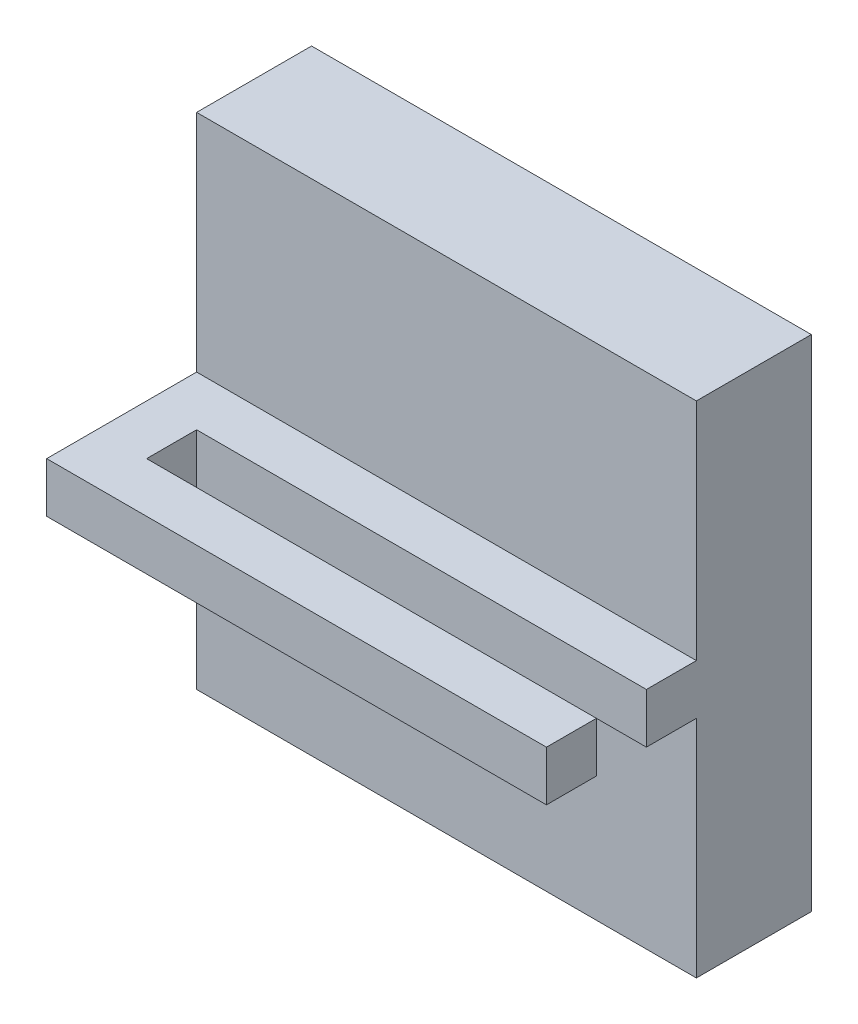
ISO-10303-21;
HEADER;
FILE_DESCRIPTION(('STEP AP214'),'2;1');
FILE_NAME('part.step','',(''),(''),'','','');
FILE_SCHEMA(('AUTOMOTIVE_DESIGN { 1 0 10303 214 1 1 1 1 }'));
ENDSEC;
DATA;
#1=APPLICATION_CONTEXT('core data for automotive mechanical design processes');
#2=APPLICATION_PROTOCOL_DEFINITION('international standard','automotive_design',2000,#1);
#3=PRODUCT_CONTEXT('',#1,'mechanical');
#4=PRODUCT('Part','Part','',(#3));
#5=PRODUCT_RELATED_PRODUCT_CATEGORY('part','',(#4));
#6=PRODUCT_DEFINITION_FORMATION('','',#4);
#7=PRODUCT_DEFINITION_CONTEXT('part definition',#1,'design');
#8=PRODUCT_DEFINITION('design','',#6,#7);
#9=PRODUCT_DEFINITION_SHAPE('','',#8);
#10=(LENGTH_UNIT() NAMED_UNIT(*) SI_UNIT(.MILLI.,.METRE.));
#11=(NAMED_UNIT(*) PLANE_ANGLE_UNIT() SI_UNIT($,.RADIAN.));
#12=(NAMED_UNIT(*) SI_UNIT($,.STERADIAN.) SOLID_ANGLE_UNIT());
#13=UNCERTAINTY_MEASURE_WITH_UNIT(LENGTH_MEASURE(1.E-05),#10,'distance_accuracy_value','');
#14=(GEOMETRIC_REPRESENTATION_CONTEXT(3) GLOBAL_UNCERTAINTY_ASSIGNED_CONTEXT((#13)) GLOBAL_UNIT_ASSIGNED_CONTEXT((#10,
#11,#12)) REPRESENTATION_CONTEXT('',''));
#15=CARTESIAN_POINT('',(0.,0.,0.));
#16=DIRECTION('',(0.,0.,1.));
#17=DIRECTION('',(1.,0.,0.));
#18=AXIS2_PLACEMENT_3D('',#15,#16,#17);
#19=CARTESIAN_POINT('',(100.,0.,23.));
#20=DIRECTION('',(-1.,0.,0.));
#21=DIRECTION('',(0.,0.,1.));
#22=AXIS2_PLACEMENT_3D('',#19,#20,#21);
#23=PLANE('',#22);
#24=DIRECTION('',(0.,0.,-1.));
#25=VECTOR('',#24,1.);
#26=CARTESIAN_POINT('',(100.,45.,53.));
#27=LINE('',#26,#25);
#28=CARTESIAN_POINT('',(100.,45.,53.));
#29=VERTEX_POINT('',#28);
#30=CARTESIAN_POINT('',(100.,45.,43.));
#31=VERTEX_POINT('',#30);
#32=EDGE_CURVE('E166',#29,#31,#27,.T.);
#33=ORIENTED_EDGE('',*,*,#32,.T.);
#34=DIRECTION('',(0.,1.,0.));
#35=VECTOR('',#34,1.);
#36=CARTESIAN_POINT('',(100.,0.,43.));
#37=LINE('',#36,#35);
#38=CARTESIAN_POINT('',(100.,55.,43.));
#39=VERTEX_POINT('',#38);
#40=EDGE_CURVE('E175',#31,#39,#37,.T.);
#41=ORIENTED_EDGE('',*,*,#40,.T.);
#42=DIRECTION('',(0.,0.,1.));
#43=VECTOR('',#42,1.);
#44=CARTESIAN_POINT('',(100.,55.,23.));
#45=LINE('',#44,#43);
#46=CARTESIAN_POINT('',(100.,55.,53.));
#47=VERTEX_POINT('',#46);
#48=EDGE_CURVE('E157',#39,#47,#45,.T.);
#49=ORIENTED_EDGE('',*,*,#48,.T.);
#50=DIRECTION('',(0.,-1.,0.));
#51=VECTOR('',#50,1.);
#52=CARTESIAN_POINT('',(100.,55.,53.));
#53=LINE('',#52,#51);
#54=EDGE_CURVE('E156',#47,#29,#53,.T.);
#55=ORIENTED_EDGE('',*,*,#54,.T.);
#56=EDGE_LOOP('',(#33,#41,#49,#55));
#57=FACE_BOUND('',#56,.T.);
#58=ADVANCED_FACE('F37',(#57),#23,.F.);
#59=CARTESIAN_POINT('',(0.,0.,23.));
#60=DIRECTION('',(0.,0.,-1.));
#61=DIRECTION('',(-1.,0.,0.));
#62=AXIS2_PLACEMENT_3D('',#59,#60,#61);
#63=PLANE('',#62);
#64=DIRECTION('',(-1.,0.,0.));
#65=VECTOR('',#64,1.);
#66=CARTESIAN_POINT('',(100.,55.,23.));
#67=LINE('',#66,#65);
#68=CARTESIAN_POINT('',(100.,55.,23.));
#69=VERTEX_POINT('',#68);
#70=CARTESIAN_POINT('',(0.,55.,23.));
#71=VERTEX_POINT('',#70);
#72=EDGE_CURVE('E189',#69,#71,#67,.T.);
#73=ORIENTED_EDGE('',*,*,#72,.F.);
#74=DIRECTION('',(0.,1.,0.));
#75=VECTOR('',#74,1.);
#76=CARTESIAN_POINT('',(100.,0.,23.));
#77=LINE('',#76,#75);
#78=CARTESIAN_POINT('',(100.,100.,23.));
#79=VERTEX_POINT('',#78);
#80=EDGE_CURVE('E154',#69,#79,#77,.T.);
#81=ORIENTED_EDGE('',*,*,#80,.T.);
#82=DIRECTION('',(-1.,0.,0.));
#83=VECTOR('',#82,1.);
#84=CARTESIAN_POINT('',(0.,100.,23.));
#85=LINE('',#84,#83);
#86=CARTESIAN_POINT('',(0.,100.,23.));
#87=VERTEX_POINT('',#86);
#88=EDGE_CURVE('E205',#79,#87,#85,.T.);
#89=ORIENTED_EDGE('',*,*,#88,.T.);
#90=DIRECTION('',(0.,-1.,0.));
#91=VECTOR('',#90,1.);
#92=CARTESIAN_POINT('',(0.,0.,23.));
#93=LINE('',#92,#91);
#94=EDGE_CURVE('E193',#87,#71,#93,.T.);
#95=ORIENTED_EDGE('',*,*,#94,.T.);
#96=EDGE_LOOP('',(#73,#81,#89,#95));
#97=FACE_BOUND('',#96,.T.);
#98=ADVANCED_FACE('F307',(#97),#63,.F.);
#99=CARTESIAN_POINT('',(0.,0.,23.));
#100=DIRECTION('',(1.,0.,0.));
#101=DIRECTION('',(0.,0.,-1.));
#102=AXIS2_PLACEMENT_3D('',#99,#100,#101);
#103=PLANE('',#102);
#104=DIRECTION('',(0.,-1.,0.));
#105=VECTOR('',#104,1.);
#106=CARTESIAN_POINT('',(0.,0.,0.));
#107=LINE('',#106,#105);
#108=CARTESIAN_POINT('',(0.,100.,0.));
#109=VERTEX_POINT('',#108);
#110=CARTESIAN_POINT('',(0.,0.,0.));
#111=VERTEX_POINT('',#110);
#112=EDGE_CURVE('E192',#109,#111,#107,.T.);
#113=ORIENTED_EDGE('',*,*,#112,.T.);
#114=DIRECTION('',(0.,0.,-1.));
#115=VECTOR('',#114,1.);
#116=CARTESIAN_POINT('',(0.,0.,23.));
#117=LINE('',#116,#115);
#118=CARTESIAN_POINT('',(0.,0.,23.));
#119=VERTEX_POINT('',#118);
#120=EDGE_CURVE('E232',#119,#111,#117,.T.);
#121=ORIENTED_EDGE('',*,*,#120,.F.);
#122=CARTESIAN_POINT('',(0.,45.,23.));
#123=VERTEX_POINT('',#122);
#124=EDGE_CURVE('E198',#123,#119,#93,.T.);
#125=ORIENTED_EDGE('',*,*,#124,.F.);
#126=DIRECTION('',(0.,0.,-1.));
#127=VECTOR('',#126,1.);
#128=CARTESIAN_POINT('',(0.,45.,53.));
#129=LINE('',#128,#127);
#130=CARTESIAN_POINT('',(0.,45.,53.));
#131=VERTEX_POINT('',#130);
#132=EDGE_CURVE('E61',#131,#123,#129,.T.);
#133=ORIENTED_EDGE('',*,*,#132,.F.);
#134=DIRECTION('',(0.,-1.,0.));
#135=VECTOR('',#134,1.);
#136=CARTESIAN_POINT('',(0.,55.,53.));
#137=LINE('',#136,#135);
#138=CARTESIAN_POINT('',(0.,55.,53.));
#139=VERTEX_POINT('',#138);
#140=EDGE_CURVE('E174',#139,#131,#137,.T.);
#141=ORIENTED_EDGE('',*,*,#140,.F.);
#142=DIRECTION('',(0.,0.,1.));
#143=VECTOR('',#142,1.);
#144=CARTESIAN_POINT('',(0.,55.,23.));
#145=LINE('',#144,#143);
#146=EDGE_CURVE('E171',#71,#139,#145,.T.);
#147=ORIENTED_EDGE('',*,*,#146,.F.);
#148=ORIENTED_EDGE('',*,*,#94,.F.);
#149=DIRECTION('',(0.,0.,-1.));
#150=VECTOR('',#149,1.);
#151=CARTESIAN_POINT('',(0.,100.,23.));
#152=LINE('',#151,#150);
#153=EDGE_CURVE('E208',#87,#109,#152,.T.);
#154=ORIENTED_EDGE('',*,*,#153,.T.);
#155=EDGE_LOOP('',(#113,#121,#125,#133,#141,#147,#148,#154));
#156=FACE_BOUND('',#155,.T.);
#157=ADVANCED_FACE('F39',(#156),#103,.F.);
#158=CARTESIAN_POINT('',(0.,0.,23.));
#159=DIRECTION('',(0.,1.,0.));
#160=DIRECTION('',(-1.,0.,0.));
#161=AXIS2_PLACEMENT_3D('',#158,#159,#160);
#162=PLANE('',#161);
#163=DIRECTION('',(1.,0.,0.));
#164=VECTOR('',#163,1.);
#165=CARTESIAN_POINT('',(0.,0.,0.));
#166=LINE('',#165,#164);
#167=CARTESIAN_POINT('',(100.,0.,0.));
#168=VERTEX_POINT('',#167);
#169=EDGE_CURVE('E212',#111,#168,#166,.T.);
#170=ORIENTED_EDGE('',*,*,#169,.T.);
#171=DIRECTION('',(0.,0.,-1.));
#172=VECTOR('',#171,1.);
#173=CARTESIAN_POINT('',(100.,0.,23.));
#174=LINE('',#173,#172);
#175=CARTESIAN_POINT('',(100.,0.,23.));
#176=VERTEX_POINT('',#175);
#177=EDGE_CURVE('E228',#176,#168,#174,.T.);
#178=ORIENTED_EDGE('',*,*,#177,.F.);
#179=DIRECTION('',(1.,0.,0.));
#180=VECTOR('',#179,1.);
#181=CARTESIAN_POINT('',(0.,0.,23.));
#182=LINE('',#181,#180);
#183=EDGE_CURVE('E197',#119,#176,#182,.T.);
#184=ORIENTED_EDGE('',*,*,#183,.F.);
#185=ORIENTED_EDGE('',*,*,#120,.T.);
#186=EDGE_LOOP('',(#170,#178,#184,#185));
#187=FACE_BOUND('',#186,.T.);
#188=ADVANCED_FACE('F295',(#187),#162,.F.);
#189=CARTESIAN_POINT('',(100.,55.,33.));
#190=VERTEX_POINT('',#189);
#191=EDGE_CURVE('E144',#69,#190,#45,.T.);
#192=ORIENTED_EDGE('',*,*,#191,.T.);
#193=DIRECTION('',(0.,1.,0.));
#194=VECTOR('',#193,1.);
#195=CARTESIAN_POINT('',(100.,0.,33.));
#196=LINE('',#195,#194);
#197=CARTESIAN_POINT('',(100.,45.,33.));
#198=VERTEX_POINT('',#197);
#199=EDGE_CURVE('E127',#198,#190,#196,.T.);
#200=ORIENTED_EDGE('',*,*,#199,.F.);
#201=CARTESIAN_POINT('',(100.,45.,23.));
#202=VERTEX_POINT('',#201);
#203=EDGE_CURVE('E162',#198,#202,#27,.T.);
#204=ORIENTED_EDGE('',*,*,#203,.T.);
#205=EDGE_CURVE('E201',#176,#202,#77,.T.);
#206=ORIENTED_EDGE('',*,*,#205,.F.);
#207=ORIENTED_EDGE('',*,*,#177,.T.);
#208=DIRECTION('',(0.,1.,0.));
#209=VECTOR('',#208,1.);
#210=CARTESIAN_POINT('',(100.,0.,0.));
#211=LINE('',#210,#209);
#212=CARTESIAN_POINT('',(100.,100.,0.));
#213=VERTEX_POINT('',#212);
#214=EDGE_CURVE('E215',#168,#213,#211,.T.);
#215=ORIENTED_EDGE('',*,*,#214,.T.);
#216=DIRECTION('',(0.,0.,-1.));
#217=VECTOR('',#216,1.);
#218=CARTESIAN_POINT('',(100.,100.,23.));
#219=LINE('',#218,#217);
#220=EDGE_CURVE('E224',#79,#213,#219,.T.);
#221=ORIENTED_EDGE('',*,*,#220,.F.);
#222=ORIENTED_EDGE('',*,*,#80,.F.);
#223=EDGE_LOOP('',(#192,#200,#204,#206,#207,#215,#221,#222));
#224=FACE_BOUND('',#223,.T.);
#225=ADVANCED_FACE('F152',(#224),#23,.F.);
#226=CARTESIAN_POINT('',(0.,100.,23.));
#227=DIRECTION('',(0.,-1.,0.));
#228=DIRECTION('',(1.,0.,0.));
#229=AXIS2_PLACEMENT_3D('',#226,#227,#228);
#230=PLANE('',#229);
#231=DIRECTION('',(-1.,0.,0.));
#232=VECTOR('',#231,1.);
#233=CARTESIAN_POINT('',(0.,100.,0.));
#234=LINE('',#233,#232);
#235=EDGE_CURVE('E218',#213,#109,#234,.T.);
#236=ORIENTED_EDGE('',*,*,#235,.T.);
#237=ORIENTED_EDGE('',*,*,#153,.F.);
#238=ORIENTED_EDGE('',*,*,#88,.F.);
#239=ORIENTED_EDGE('',*,*,#220,.T.);
#240=EDGE_LOOP('',(#236,#237,#238,#239));
#241=FACE_BOUND('',#240,.T.);
#242=ADVANCED_FACE('F303',(#241),#230,.F.);
#243=ORIENTED_EDGE('',*,*,#205,.T.);
#244=DIRECTION('',(-1.,0.,0.));
#245=VECTOR('',#244,1.);
#246=CARTESIAN_POINT('',(100.,45.,23.));
#247=LINE('',#246,#245);
#248=EDGE_CURVE('E170',#202,#123,#247,.T.);
#249=ORIENTED_EDGE('',*,*,#248,.T.);
#250=ORIENTED_EDGE('',*,*,#124,.T.);
#251=ORIENTED_EDGE('',*,*,#183,.T.);
#252=EDGE_LOOP('',(#243,#249,#250,#251));
#253=FACE_BOUND('',#252,.T.);
#254=ADVANCED_FACE('F292',(#253),#63,.F.);
#255=CARTESIAN_POINT('',(0.,0.,0.));
#256=DIRECTION('',(0.,0.,-1.));
#257=DIRECTION('',(-1.,0.,0.));
#258=AXIS2_PLACEMENT_3D('',#255,#256,#257);
#259=PLANE('',#258);
#260=ORIENTED_EDGE('',*,*,#112,.F.);
#261=ORIENTED_EDGE('',*,*,#235,.F.);
#262=ORIENTED_EDGE('',*,*,#214,.F.);
#263=ORIENTED_EDGE('',*,*,#169,.F.);
#264=EDGE_LOOP('',(#260,#261,#262,#263));
#265=FACE_BOUND('',#264,.T.);
#266=ADVANCED_FACE('F300',(#265),#259,.T.);
#267=CARTESIAN_POINT('',(100.,55.,23.));
#268=DIRECTION('',(0.,-1.,0.));
#269=DIRECTION('',(0.,0.,-1.));
#270=AXIS2_PLACEMENT_3D('',#267,#268,#269);
#271=PLANE('',#270);
#272=ORIENTED_EDGE('',*,*,#48,.F.);
#273=DIRECTION('',(1.,0.,0.));
#274=VECTOR('',#273,1.);
#275=CARTESIAN_POINT('',(10.,55.,43.));
#276=LINE('',#275,#274);
#277=CARTESIAN_POINT('',(10.,55.,43.));
#278=VERTEX_POINT('',#277);
#279=EDGE_CURVE('E138',#278,#39,#276,.T.);
#280=ORIENTED_EDGE('',*,*,#279,.F.);
#281=DIRECTION('',(0.,0.,1.));
#282=VECTOR('',#281,1.);
#283=CARTESIAN_POINT('',(9.99999999999999,55.,33.));
#284=LINE('',#283,#282);
#285=CARTESIAN_POINT('',(9.99999999999999,55.,33.));
#286=VERTEX_POINT('',#285);
#287=EDGE_CURVE('E148',#286,#278,#284,.T.);
#288=ORIENTED_EDGE('',*,*,#287,.F.);
#289=DIRECTION('',(-1.,0.,0.));
#290=VECTOR('',#289,1.);
#291=CARTESIAN_POINT('',(100.,55.,33.));
#292=LINE('',#291,#290);
#293=EDGE_CURVE('E130',#190,#286,#292,.T.);
#294=ORIENTED_EDGE('',*,*,#293,.F.);
#295=ORIENTED_EDGE('',*,*,#191,.F.);
#296=ORIENTED_EDGE('',*,*,#72,.T.);
#297=ORIENTED_EDGE('',*,*,#146,.T.);
#298=DIRECTION('',(-1.,0.,0.));
#299=VECTOR('',#298,1.);
#300=CARTESIAN_POINT('',(100.,55.,53.));
#301=LINE('',#300,#299);
#302=EDGE_CURVE('E185',#47,#139,#301,.T.);
#303=ORIENTED_EDGE('',*,*,#302,.F.);
#304=EDGE_LOOP('',(#272,#280,#288,#294,#295,#296,#297,#303));
#305=FACE_BOUND('',#304,.T.);
#306=ADVANCED_FACE('F142',(#305),#271,.F.);
#307=CARTESIAN_POINT('',(100.,55.,53.));
#308=DIRECTION('',(0.,0.,-1.));
#309=DIRECTION('',(0.,1.,0.));
#310=AXIS2_PLACEMENT_3D('',#307,#308,#309);
#311=PLANE('',#310);
#312=ORIENTED_EDGE('',*,*,#140,.T.);
#313=DIRECTION('',(-1.,0.,0.));
#314=VECTOR('',#313,1.);
#315=CARTESIAN_POINT('',(100.,45.,53.));
#316=LINE('',#315,#314);
#317=EDGE_CURVE('E182',#29,#131,#316,.T.);
#318=ORIENTED_EDGE('',*,*,#317,.F.);
#319=ORIENTED_EDGE('',*,*,#54,.F.);
#320=ORIENTED_EDGE('',*,*,#302,.T.);
#321=EDGE_LOOP('',(#312,#318,#319,#320));
#322=FACE_BOUND('',#321,.T.);
#323=ADVANCED_FACE('F270',(#322),#311,.F.);
#324=CARTESIAN_POINT('',(100.,45.,53.));
#325=DIRECTION('',(0.,1.,0.));
#326=DIRECTION('',(0.,0.,1.));
#327=AXIS2_PLACEMENT_3D('',#324,#325,#326);
#328=PLANE('',#327);
#329=DIRECTION('',(0.,0.,1.));
#330=VECTOR('',#329,1.);
#331=CARTESIAN_POINT('',(10.,45.,53.0000000000001));
#332=LINE('',#331,#330);
#333=CARTESIAN_POINT('',(9.99999999999999,45.,33.));
#334=VERTEX_POINT('',#333);
#335=CARTESIAN_POINT('',(10.,45.,43.));
#336=VERTEX_POINT('',#335);
#337=EDGE_CURVE('E46',#334,#336,#332,.T.);
#338=ORIENTED_EDGE('',*,*,#337,.T.);
#339=DIRECTION('',(1.,0.,0.));
#340=VECTOR('',#339,1.);
#341=CARTESIAN_POINT('',(100.,45.,43.));
#342=LINE('',#341,#340);
#343=EDGE_CURVE('E11',#336,#31,#342,.T.);
#344=ORIENTED_EDGE('',*,*,#343,.T.);
#345=ORIENTED_EDGE('',*,*,#32,.F.);
#346=ORIENTED_EDGE('',*,*,#317,.T.);
#347=ORIENTED_EDGE('',*,*,#132,.T.);
#348=ORIENTED_EDGE('',*,*,#248,.F.);
#349=ORIENTED_EDGE('',*,*,#203,.F.);
#350=DIRECTION('',(-1.,0.,0.));
#351=VECTOR('',#350,1.);
#352=CARTESIAN_POINT('',(100.,45.,33.));
#353=LINE('',#352,#351);
#354=EDGE_CURVE('E133',#198,#334,#353,.T.);
#355=ORIENTED_EDGE('',*,*,#354,.T.);
#356=EDGE_LOOP('',(#338,#344,#345,#346,#347,#348,#349,#355));
#357=FACE_BOUND('',#356,.T.);
#358=ADVANCED_FACE('F240',(#357),#328,.F.);
#359=CARTESIAN_POINT('',(10.,0.,43.));
#360=DIRECTION('',(0.,0.,1.));
#361=DIRECTION('',(0.,-1.,0.));
#362=AXIS2_PLACEMENT_3D('',#359,#360,#361);
#363=PLANE('',#362);
#364=DIRECTION('',(0.,1.,0.));
#365=VECTOR('',#364,1.);
#366=CARTESIAN_POINT('',(10.,0.,43.));
#367=LINE('',#366,#365);
#368=EDGE_CURVE('E245',#336,#278,#367,.T.);
#369=ORIENTED_EDGE('',*,*,#368,.T.);
#370=ORIENTED_EDGE('',*,*,#279,.T.);
#371=ORIENTED_EDGE('',*,*,#40,.F.);
#372=ORIENTED_EDGE('',*,*,#343,.F.);
#373=EDGE_LOOP('',(#369,#370,#371,#372));
#374=FACE_BOUND('',#373,.T.);
#375=ADVANCED_FACE('F263',(#374),#363,.F.);
#376=CARTESIAN_POINT('',(9.99999999999999,0.,33.));
#377=DIRECTION('',(-1.,0.,0.));
#378=DIRECTION('',(0.,0.,1.));
#379=AXIS2_PLACEMENT_3D('',#376,#377,#378);
#380=PLANE('',#379);
#381=DIRECTION('',(0.,1.,0.));
#382=VECTOR('',#381,1.);
#383=CARTESIAN_POINT('',(9.99999999999999,0.,33.));
#384=LINE('',#383,#382);
#385=EDGE_CURVE('E53',#334,#286,#384,.T.);
#386=ORIENTED_EDGE('',*,*,#385,.T.);
#387=ORIENTED_EDGE('',*,*,#287,.T.);
#388=ORIENTED_EDGE('',*,*,#368,.F.);
#389=ORIENTED_EDGE('',*,*,#337,.F.);
#390=EDGE_LOOP('',(#386,#387,#388,#389));
#391=FACE_BOUND('',#390,.T.);
#392=ADVANCED_FACE('F244',(#391),#380,.F.);
#393=CARTESIAN_POINT('',(100.,0.,33.));
#394=DIRECTION('',(0.,0.,-1.));
#395=DIRECTION('',(0.,1.,0.));
#396=AXIS2_PLACEMENT_3D('',#393,#394,#395);
#397=PLANE('',#396);
#398=ORIENTED_EDGE('',*,*,#199,.T.);
#399=ORIENTED_EDGE('',*,*,#293,.T.);
#400=ORIENTED_EDGE('',*,*,#385,.F.);
#401=ORIENTED_EDGE('',*,*,#354,.F.);
#402=EDGE_LOOP('',(#398,#399,#400,#401));
#403=FACE_BOUND('',#402,.T.);
#404=ADVANCED_FACE('F129',(#403),#397,.F.);
#405=CLOSED_SHELL('',(#58,#98,#157,#188,#225,#242,#254,#266,#306,#323,#358,#375,#392,#404));
#406=MANIFOLD_SOLID_BREP('B2',#405);
#407=ADVANCED_BREP_SHAPE_REPRESENTATION('',(#18,#406),#14);
#408=SHAPE_DEFINITION_REPRESENTATION(#9,#407);
ENDSEC;
END-ISO-10303-21;
